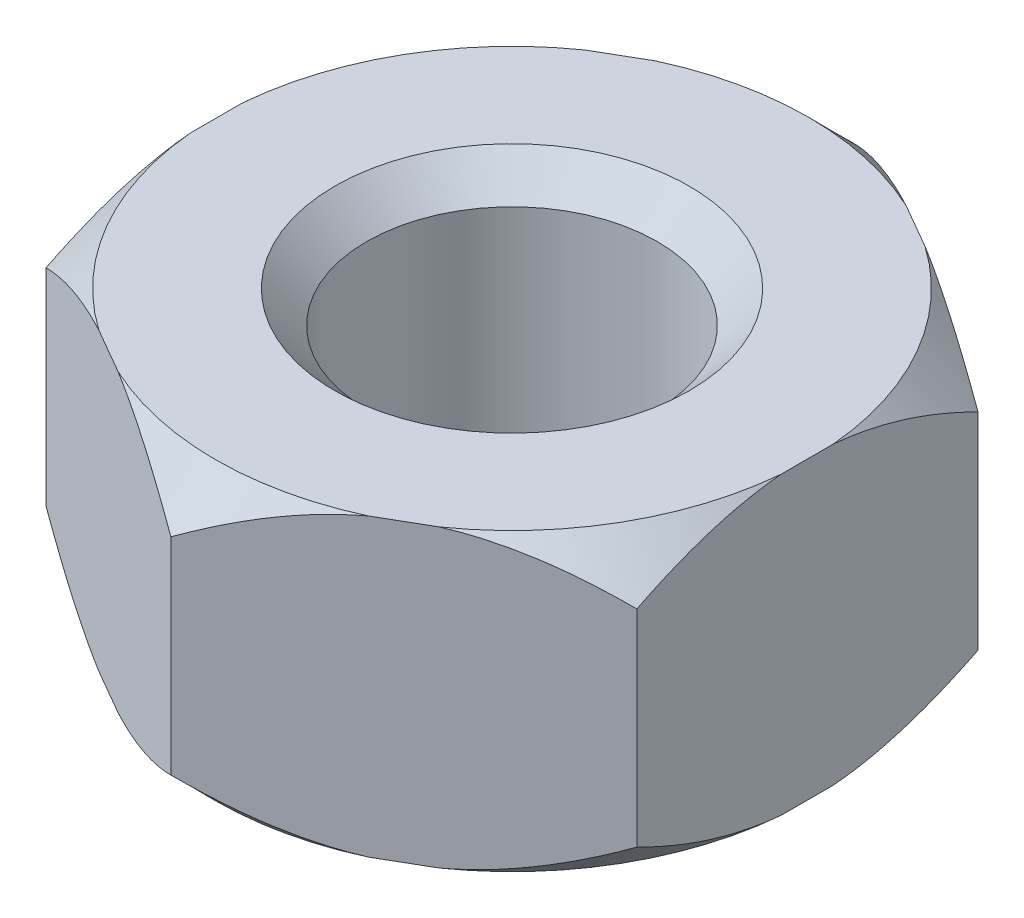
ISO-10303-21;
HEADER;
FILE_DESCRIPTION(('STEP AP214'),'2;1');
FILE_NAME('part.step','',(''),(''),'','','');
FILE_SCHEMA(('AUTOMOTIVE_DESIGN { 1 0 10303 214 1 1 1 1 }'));
ENDSEC;
DATA;
#1=APPLICATION_CONTEXT('core data for automotive mechanical design processes');
#2=APPLICATION_PROTOCOL_DEFINITION('international standard','automotive_design',2000,#1);
#3=PRODUCT_CONTEXT('',#1,'mechanical');
#4=PRODUCT('Part','Part','',(#3));
#5=PRODUCT_RELATED_PRODUCT_CATEGORY('part','',(#4));
#6=PRODUCT_DEFINITION_FORMATION('','',#4);
#7=PRODUCT_DEFINITION_CONTEXT('part definition',#1,'design');
#8=PRODUCT_DEFINITION('design','',#6,#7);
#9=PRODUCT_DEFINITION_SHAPE('','',#8);
#10=(LENGTH_UNIT() NAMED_UNIT(*) SI_UNIT(.MILLI.,.METRE.));
#11=(NAMED_UNIT(*) PLANE_ANGLE_UNIT() SI_UNIT($,.RADIAN.));
#12=(NAMED_UNIT(*) SI_UNIT($,.STERADIAN.) SOLID_ANGLE_UNIT());
#13=UNCERTAINTY_MEASURE_WITH_UNIT(LENGTH_MEASURE(1.E-05),#10,'distance_accuracy_value','');
#14=(GEOMETRIC_REPRESENTATION_CONTEXT(3) GLOBAL_UNCERTAINTY_ASSIGNED_CONTEXT((#13)) GLOBAL_UNIT_ASSIGNED_CONTEXT((#10,
#11,#12)) REPRESENTATION_CONTEXT('',''));
#15=CARTESIAN_POINT('',(0.,0.,0.));
#16=DIRECTION('',(0.,0.,1.));
#17=DIRECTION('',(1.,0.,0.));
#18=AXIS2_PLACEMENT_3D('',#15,#16,#17);
#19=CARTESIAN_POINT('',(0.,5.,0.));
#20=DIRECTION('',(0.,1.,0.));
#21=DIRECTION('',(0.,0.,1.));
#22=AXIS2_PLACEMENT_3D('',#19,#20,#21);
#23=PLANE('',#22);
#24=CARTESIAN_POINT('',(0.,5.,0.));
#25=DIRECTION('',(0.,-1.,0.));
#26=DIRECTION('',(1.,0.,0.));
#27=AXIS2_PLACEMENT_3D('',#24,#25,#26);
#28=CIRCLE('',#27,3.);
#29=CARTESIAN_POINT('',(3.,5.,0.));
#30=VERTEX_POINT('',#29);
#31=EDGE_CURVE('E20',#30,#30,#28,.T.);
#32=ORIENTED_EDGE('',*,*,#31,.T.);
#33=EDGE_LOOP('',(#32));
#34=FACE_BOUND('',#33,.T.);
#35=CARTESIAN_POINT('',(0.,5.,0.));
#36=DIRECTION('',(0.,1.,0.));
#37=DIRECTION('',(0.,0.,1.));
#38=AXIS2_PLACEMENT_3D('',#35,#36,#37);
#39=CIRCLE('',#38,5.0192554586306);
#40=CARTESIAN_POINT('',(-5.,5.,0.439232693447428));
#41=VERTEX_POINT('',#40);
#42=CARTESIAN_POINT('',(-2.88038667069811,5.,4.11051067219849));
#43=VERTEX_POINT('',#42);
#44=EDGE_CURVE('E151',#41,#43,#39,.T.);
#45=ORIENTED_EDGE('',*,*,#44,.T.);
#46=DIRECTION('',(0.866025403784433,0.,0.500000000000009));
#47=VECTOR('',#46,1.);
#48=CARTESIAN_POINT('',(-5.,5.,2.8867513459481));
#49=LINE('',#48,#47);
#50=CARTESIAN_POINT('',(-2.11961332930199,5.,4.54974336564585));
#51=VERTEX_POINT('',#50);
#52=EDGE_CURVE('E274',#43,#51,#49,.T.);
#53=ORIENTED_EDGE('',*,*,#52,.T.);
#54=CARTESIAN_POINT('',(0.,5.,0.));
#55=DIRECTION('',(0.,1.,0.));
#56=DIRECTION('',(0.,0.,1.));
#57=AXIS2_PLACEMENT_3D('',#54,#55,#56);
#58=CIRCLE('',#57,5.0192554586306);
#59=CARTESIAN_POINT('',(2.11961332930199,5.,4.54974336564585));
#60=VERTEX_POINT('',#59);
#61=EDGE_CURVE('E305',#51,#60,#58,.T.);
#62=ORIENTED_EDGE('',*,*,#61,.T.);
#63=DIRECTION('',(0.866025403784433,0.,-0.500000000000009));
#64=VECTOR('',#63,1.);
#65=CARTESIAN_POINT('',(0.,5.,5.7735026918963));
#66=LINE('',#65,#64);
#67=CARTESIAN_POINT('',(2.88038667069811,5.,4.11051067219849));
#68=VERTEX_POINT('',#67);
#69=EDGE_CURVE('E11',#60,#68,#66,.T.);
#70=ORIENTED_EDGE('',*,*,#69,.T.);
#71=CARTESIAN_POINT('',(0.,5.,0.));
#72=DIRECTION('',(0.,1.,0.));
#73=DIRECTION('',(0.,0.,1.));
#74=AXIS2_PLACEMENT_3D('',#71,#72,#73);
#75=CIRCLE('',#74,5.0192554586306);
#76=CARTESIAN_POINT('',(5.,5.,0.439232693447428));
#77=VERTEX_POINT('',#76);
#78=EDGE_CURVE('E304',#68,#77,#75,.T.);
#79=ORIENTED_EDGE('',*,*,#78,.T.);
#80=DIRECTION('',(0.,0.,-1.));
#81=VECTOR('',#80,1.);
#82=CARTESIAN_POINT('',(5.,5.,2.8867513459481));
#83=LINE('',#82,#81);
#84=CARTESIAN_POINT('',(5.,5.,-0.439232693447428));
#85=VERTEX_POINT('',#84);
#86=EDGE_CURVE('E246',#77,#85,#83,.T.);
#87=ORIENTED_EDGE('',*,*,#86,.T.);
#88=CARTESIAN_POINT('',(0.,5.,0.));
#89=DIRECTION('',(0.,1.,0.));
#90=DIRECTION('',(0.,0.,1.));
#91=AXIS2_PLACEMENT_3D('',#88,#89,#90);
#92=CIRCLE('',#91,5.0192554586306);
#93=CARTESIAN_POINT('',(2.88038667069811,5.,-4.11051067219849));
#94=VERTEX_POINT('',#93);
#95=EDGE_CURVE('E327',#85,#94,#92,.T.);
#96=ORIENTED_EDGE('',*,*,#95,.T.);
#97=DIRECTION('',(-0.866025403784433,0.,-0.500000000000009));
#98=VECTOR('',#97,1.);
#99=CARTESIAN_POINT('',(5.,5.,-2.8867513459481));
#100=LINE('',#99,#98);
#101=CARTESIAN_POINT('',(2.11961332930199,5.,-4.54974336564585));
#102=VERTEX_POINT('',#101);
#103=EDGE_CURVE('E365',#94,#102,#100,.T.);
#104=ORIENTED_EDGE('',*,*,#103,.T.);
#105=CARTESIAN_POINT('',(0.,5.,0.));
#106=DIRECTION('',(0.,1.,0.));
#107=DIRECTION('',(0.,0.,1.));
#108=AXIS2_PLACEMENT_3D('',#105,#106,#107);
#109=CIRCLE('',#108,5.0192554586306);
#110=CARTESIAN_POINT('',(-2.11961332930199,5.,-4.54974336564585));
#111=VERTEX_POINT('',#110);
#112=EDGE_CURVE('E500',#102,#111,#109,.T.);
#113=ORIENTED_EDGE('',*,*,#112,.T.);
#114=DIRECTION('',(-0.866025403784433,0.,0.500000000000009));
#115=VECTOR('',#114,1.);
#116=CARTESIAN_POINT('',(0.,5.,-5.7735026918963));
#117=LINE('',#116,#115);
#118=CARTESIAN_POINT('',(-2.88038667069811,5.,-4.11051067219849));
#119=VERTEX_POINT('',#118);
#120=EDGE_CURVE('E267',#111,#119,#117,.T.);
#121=ORIENTED_EDGE('',*,*,#120,.T.);
#122=CARTESIAN_POINT('',(0.,5.,0.));
#123=DIRECTION('',(0.,1.,0.));
#124=DIRECTION('',(0.,0.,1.));
#125=AXIS2_PLACEMENT_3D('',#122,#123,#124);
#126=CIRCLE('',#125,5.0192554586306);
#127=CARTESIAN_POINT('',(-5.,5.,-0.439232693447428));
#128=VERTEX_POINT('',#127);
#129=EDGE_CURVE('E143',#119,#128,#126,.T.);
#130=ORIENTED_EDGE('',*,*,#129,.T.);
#131=DIRECTION('',(0.,0.,1.));
#132=VECTOR('',#131,1.);
#133=CARTESIAN_POINT('',(-5.,5.,-2.8867513459481));
#134=LINE('',#133,#132);
#135=EDGE_CURVE('E278',#128,#41,#134,.T.);
#136=ORIENTED_EDGE('',*,*,#135,.T.);
#137=EDGE_LOOP('',(#45,#53,#62,#70,#79,#87,#96,#104,#113,#121,#130,#136));
#138=FACE_BOUND('',#137,.T.);
#139=ADVANCED_FACE('F16',(#34,#138),#23,.T.);
#140=CARTESIAN_POINT('',(0.,0.,5.7735026918963));
#141=DIRECTION('',(0.500000000000009,0.,0.866025403784433));
#142=DIRECTION('',(0.866025403784433,0.,-0.500000000000009));
#143=AXIS2_PLACEMENT_3D('',#140,#141,#142);
#144=PLANE('',#143);
#145=CARTESIAN_POINT('',(0.,0.7542472332657,5.7735026918963));
#146=CARTESIAN_POINT('',(1.13387079482611,0.0996066246465835,5.11886208327718));
#147=CARTESIAN_POINT('',(2.11961332930197,0.,4.54974336564586));
#148=(BOUNDED_CURVE() B_SPLINE_CURVE(2,(#145,#146,#147),.UNSPECIFIED.,.F.,
.F.) B_SPLINE_CURVE_WITH_KNOTS((3,3),(0.2476817583387,0.548103615273101),
.UNSPECIFIED.) CURVE() GEOMETRIC_REPRESENTATION_ITEM() RATIONAL_B_SPLINE_CURVE((1.04467917037567,
1.04943604844896,1.)) REPRESENTATION_ITEM(''));
#149=CARTESIAN_POINT('',(0.,0.7542472332657,5.7735026918963));
#150=VERTEX_POINT('',#149);
#151=CARTESIAN_POINT('',(2.11961332930198,0.,4.54974336564585));
#152=VERTEX_POINT('',#151);
#153=EDGE_CURVE('E205',#150,#152,#148,.T.);
#154=ORIENTED_EDGE('',*,*,#153,.T.);
#155=DIRECTION('',(0.866025403784433,0.,-0.500000000000009));
#156=VECTOR('',#155,1.);
#157=CARTESIAN_POINT('',(0.,0.,5.7735026918963));
#158=LINE('',#157,#156);
#159=CARTESIAN_POINT('',(2.88038667069813,0.,4.11051067219849));
#160=VERTEX_POINT('',#159);
#161=EDGE_CURVE('E252',#152,#160,#158,.T.);
#162=ORIENTED_EDGE('',*,*,#161,.T.);
#163=CARTESIAN_POINT('',(2.88038667069813,0.,4.11051067219848));
#164=CARTESIAN_POINT('',(3.86612920517395,0.0996066246465778,3.54139195456719));
#165=CARTESIAN_POINT('',(5.,0.754247233265643,2.8867513459481));
#166=(BOUNDED_CURVE() B_SPLINE_CURVE(2,(#163,#164,#165),.UNSPECIFIED.,.F.,
.F.) B_SPLINE_CURVE_WITH_KNOTS((3,3),(0.,0.300421856934388),
.UNSPECIFIED.) CURVE() GEOMETRIC_REPRESENTATION_ITEM() RATIONAL_B_SPLINE_CURVE((1.,
1.04943604844896,1.04467917037568)) REPRESENTATION_ITEM(''));
#167=CARTESIAN_POINT('',(5.,0.754247233265643,2.8867513459481));
#168=VERTEX_POINT('',#167);
#169=EDGE_CURVE('E349',#160,#168,#166,.T.);
#170=ORIENTED_EDGE('',*,*,#169,.T.);
#171=DIRECTION('',(0.,1.,0.));
#172=VECTOR('',#171,1.);
#173=CARTESIAN_POINT('',(5.,0.,2.8867513459481));
#174=LINE('',#173,#172);
#175=CARTESIAN_POINT('',(5.,4.24575276673436,2.8867513459481));
#176=VERTEX_POINT('',#175);
#177=EDGE_CURVE('E323',#168,#176,#174,.T.);
#178=ORIENTED_EDGE('',*,*,#177,.T.);
#179=CARTESIAN_POINT('',(5.00000000000001,4.24575276673436,2.8867513459481));
#180=CARTESIAN_POINT('',(3.86612920517394,4.90039337535343,3.5413919545672));
#181=CARTESIAN_POINT('',(2.88038667069813,5.,4.11051067219849));
#182=(BOUNDED_CURVE() B_SPLINE_CURVE(2,(#179,#180,#181),.UNSPECIFIED.,.F.,
.F.) B_SPLINE_CURVE_WITH_KNOTS((3,3),(0.247681758338713,0.548103615273102),
.UNSPECIFIED.) CURVE() GEOMETRIC_REPRESENTATION_ITEM() RATIONAL_B_SPLINE_CURVE((1.04467917037568,
1.04943604844896,1.)) REPRESENTATION_ITEM(''));
#183=EDGE_CURVE('E314',#176,#68,#182,.T.);
#184=ORIENTED_EDGE('',*,*,#183,.T.);
#185=ORIENTED_EDGE('',*,*,#69,.F.);
#186=CARTESIAN_POINT('',(2.11961332930198,5.,4.54974336564585));
#187=CARTESIAN_POINT('',(1.13387079482612,4.90039337535343,5.11886208327718));
#188=CARTESIAN_POINT('',(0.,4.2457527667343,5.7735026918963));
#189=(BOUNDED_CURVE() B_SPLINE_CURVE(2,(#186,#187,#188),.UNSPECIFIED.,.F.,
.F.) B_SPLINE_CURVE_WITH_KNOTS((3,3),(0.,0.300421856934402),
.UNSPECIFIED.) CURVE() GEOMETRIC_REPRESENTATION_ITEM() RATIONAL_B_SPLINE_CURVE((1.,
1.04943604844896,1.04467917037567)) REPRESENTATION_ITEM(''));
#190=CARTESIAN_POINT('',(0.,4.2457527667343,5.7735026918963));
#191=VERTEX_POINT('',#190);
#192=EDGE_CURVE('E317',#60,#191,#189,.T.);
#193=ORIENTED_EDGE('',*,*,#192,.T.);
#194=DIRECTION('',(0.,1.,0.));
#195=VECTOR('',#194,1.);
#196=CARTESIAN_POINT('',(0.,0.,5.7735026918963));
#197=LINE('',#196,#195);
#198=EDGE_CURVE('E275',#150,#191,#197,.T.);
#199=ORIENTED_EDGE('',*,*,#198,.F.);
#200=EDGE_LOOP('',(#154,#162,#170,#178,#184,#185,#193,#199));
#201=FACE_BOUND('',#200,.T.);
#202=ADVANCED_FACE('F612',(#201),#144,.T.);
#203=CARTESIAN_POINT('',(0.,0.27075,0.));
#204=DIRECTION('',(0.,-1.,0.));
#205=DIRECTION('',(1.,0.,0.));
#206=AXIS2_PLACEMENT_3D('',#203,#204,#205);
#207=CONICAL_SURFACE('',#206,2.72925,0.785398163397449);
#208=CARTESIAN_POINT('',(0.,0.5415,0.));
#209=DIRECTION('',(0.,-1.,0.));
#210=DIRECTION('',(1.,0.,0.));
#211=AXIS2_PLACEMENT_3D('',#208,#209,#210);
#212=CIRCLE('',#211,2.4585);
#213=CARTESIAN_POINT('',(2.4585,0.5415,0.));
#214=VERTEX_POINT('',#213);
#215=EDGE_CURVE('E27',#214,#214,#212,.T.);
#216=ORIENTED_EDGE('',*,*,#215,.F.);
#217=EDGE_LOOP('',(#216));
#218=FACE_BOUND('',#217,.T.);
#219=CARTESIAN_POINT('',(0.,0.,0.));
#220=DIRECTION('',(0.,1.,0.));
#221=DIRECTION('',(1.,0.,0.));
#222=AXIS2_PLACEMENT_3D('',#219,#220,#221);
#223=CIRCLE('',#222,3.);
#224=CARTESIAN_POINT('',(3.,0.,0.));
#225=VERTEX_POINT('',#224);
#226=EDGE_CURVE('E238',#225,#225,#223,.T.);
#227=ORIENTED_EDGE('',*,*,#226,.F.);
#228=EDGE_LOOP('',(#227));
#229=FACE_BOUND('',#228,.T.);
#230=ADVANCED_FACE('F637',(#218,#229),#207,.F.);
#231=CARTESIAN_POINT('',(0.,2.5,0.));
#232=DIRECTION('',(0.,1.,0.));
#233=DIRECTION('',(1.,0.,0.));
#234=AXIS2_PLACEMENT_3D('',#231,#232,#233);
#235=CYLINDRICAL_SURFACE('',#234,2.4585);
#236=CARTESIAN_POINT('',(0.,4.4585,0.));
#237=DIRECTION('',(0.,-1.,0.));
#238=DIRECTION('',(1.,0.,0.));
#239=AXIS2_PLACEMENT_3D('',#236,#237,#238);
#240=CIRCLE('',#239,2.4585);
#241=CARTESIAN_POINT('',(2.4585,4.4585,0.));
#242=VERTEX_POINT('',#241);
#243=EDGE_CURVE('E268',#242,#242,#240,.T.);
#244=ORIENTED_EDGE('',*,*,#243,.F.);
#245=EDGE_LOOP('',(#244));
#246=FACE_BOUND('',#245,.T.);
#247=ORIENTED_EDGE('',*,*,#215,.T.);
#248=EDGE_LOOP('',(#247));
#249=FACE_BOUND('',#248,.T.);
#250=ADVANCED_FACE('F18',(#246,#249),#235,.F.);
#251=CARTESIAN_POINT('',(0.,4.72925,0.));
#252=DIRECTION('',(0.,1.,0.));
#253=DIRECTION('',(1.,0.,0.));
#254=AXIS2_PLACEMENT_3D('',#251,#252,#253);
#255=CONICAL_SURFACE('',#254,2.72925,0.785398163397449);
#256=ORIENTED_EDGE('',*,*,#31,.F.);
#257=EDGE_LOOP('',(#256));
#258=FACE_BOUND('',#257,.T.);
#259=ORIENTED_EDGE('',*,*,#243,.T.);
#260=EDGE_LOOP('',(#259));
#261=FACE_BOUND('',#260,.T.);
#262=ADVANCED_FACE('F660',(#258,#261),#255,.F.);
#263=CARTESIAN_POINT('',(-5.,0.,2.8867513459481));
#264=DIRECTION('',(-0.500000000000009,0.,0.866025403784433));
#265=DIRECTION('',(0.866025403784433,0.,0.500000000000009));
#266=AXIS2_PLACEMENT_3D('',#263,#264,#265);
#267=PLANE('',#266);
#268=CARTESIAN_POINT('',(-2.11961332930199,0.,4.54974336564585));
#269=CARTESIAN_POINT('',(-1.13387079482612,0.0996066246465761,5.11886208327717));
#270=CARTESIAN_POINT('',(0.,0.754247233265701,5.77350269189631));
#271=(BOUNDED_CURVE() B_SPLINE_CURVE(2,(#268,#269,#270),.UNSPECIFIED.,.F.,
.F.) B_SPLINE_CURVE_WITH_KNOTS((3,3),(0.,0.300421856934404),
.UNSPECIFIED.) CURVE() GEOMETRIC_REPRESENTATION_ITEM() RATIONAL_B_SPLINE_CURVE((1.,
1.04943604844896,1.04467917037567)) REPRESENTATION_ITEM(''));
#272=CARTESIAN_POINT('',(-2.11961332930198,0.,4.54974336564585));
#273=VERTEX_POINT('',#272);
#274=EDGE_CURVE('E384',#273,#150,#271,.T.);
#275=ORIENTED_EDGE('',*,*,#274,.T.);
#276=ORIENTED_EDGE('',*,*,#198,.T.);
#277=CARTESIAN_POINT('',(0.,4.24575276673431,5.77350269189631));
#278=CARTESIAN_POINT('',(-1.13387079482612,4.90039337535343,5.11886208327718));
#279=CARTESIAN_POINT('',(-2.11961332930199,5.,4.54974336564585));
#280=(BOUNDED_CURVE() B_SPLINE_CURVE(2,(#277,#278,#279),.UNSPECIFIED.,.F.,
.F.) B_SPLINE_CURVE_WITH_KNOTS((3,3),(0.247681758338699,0.548103615273103),
.UNSPECIFIED.) CURVE() GEOMETRIC_REPRESENTATION_ITEM() RATIONAL_B_SPLINE_CURVE((1.04467917037568,
1.04943604844896,1.)) REPRESENTATION_ITEM(''));
#281=EDGE_CURVE('E299',#191,#51,#280,.T.);
#282=ORIENTED_EDGE('',*,*,#281,.T.);
#283=ORIENTED_EDGE('',*,*,#52,.F.);
#284=CARTESIAN_POINT('',(-2.88038667069811,5.,4.11051067219849));
#285=CARTESIAN_POINT('',(-3.86612920517394,4.90039337535343,3.5413919545672));
#286=CARTESIAN_POINT('',(-5.,4.24575276673436,2.8867513459481));
#287=(BOUNDED_CURVE() B_SPLINE_CURVE(2,(#284,#285,#286),.UNSPECIFIED.,.F.,
.F.) B_SPLINE_CURVE_WITH_KNOTS((3,3),(0.,0.30042185693439),
.UNSPECIFIED.) CURVE() GEOMETRIC_REPRESENTATION_ITEM() RATIONAL_B_SPLINE_CURVE((1.,
1.04943604844896,1.04467917037568)) REPRESENTATION_ITEM(''));
#288=CARTESIAN_POINT('',(-5.,4.24575276673436,2.8867513459481));
#289=VERTEX_POINT('',#288);
#290=EDGE_CURVE('E200',#43,#289,#287,.T.);
#291=ORIENTED_EDGE('',*,*,#290,.T.);
#292=DIRECTION('',(0.,1.,0.));
#293=VECTOR('',#292,1.);
#294=CARTESIAN_POINT('',(-5.,0.,2.8867513459481));
#295=LINE('',#294,#293);
#296=CARTESIAN_POINT('',(-5.,0.754247233265643,2.8867513459481));
#297=VERTEX_POINT('',#296);
#298=EDGE_CURVE('E194',#297,#289,#295,.T.);
#299=ORIENTED_EDGE('',*,*,#298,.F.);
#300=CARTESIAN_POINT('',(-5.00000000000001,0.754247233265644,2.8867513459481));
#301=CARTESIAN_POINT('',(-3.86612920517394,0.0996066246465715,3.5413919545672));
#302=CARTESIAN_POINT('',(-2.88038667069811,0.,4.11051067219849));
#303=(BOUNDED_CURVE() B_SPLINE_CURVE(2,(#300,#301,#302),.UNSPECIFIED.,.F.,
.F.) B_SPLINE_CURVE_WITH_KNOTS((3,3),(0.247681758338713,0.548103615273103),
.UNSPECIFIED.) CURVE() GEOMETRIC_REPRESENTATION_ITEM() RATIONAL_B_SPLINE_CURVE((1.04467917037567,
1.04943604844896,1.)) REPRESENTATION_ITEM(''));
#304=CARTESIAN_POINT('',(-2.88038667069813,0.,4.11051067219849));
#305=VERTEX_POINT('',#304);
#306=EDGE_CURVE('E199',#297,#305,#303,.T.);
#307=ORIENTED_EDGE('',*,*,#306,.T.);
#308=DIRECTION('',(0.866025403784433,0.,0.500000000000009));
#309=VECTOR('',#308,1.);
#310=CARTESIAN_POINT('',(-5.,0.,2.8867513459481));
#311=LINE('',#310,#309);
#312=EDGE_CURVE('E243',#305,#273,#311,.T.);
#313=ORIENTED_EDGE('',*,*,#312,.T.);
#314=EDGE_LOOP('',(#275,#276,#282,#283,#291,#299,#307,#313));
#315=FACE_BOUND('',#314,.T.);
#316=ADVANCED_FACE('F197',(#315),#267,.T.);
#317=CARTESIAN_POINT('',(0.,4.59584969796075,0.));
#318=DIRECTION('',(0.,-1.,0.));
#319=DIRECTION('',(0.,0.,1.));
#320=AXIS2_PLACEMENT_3D('',#317,#318,#319);
#321=CONICAL_SURFACE('',#320,5.42340576066985,0.785398163397448);
#322=CARTESIAN_POINT('',(-5.,4.24575276673436,2.8867513459481));
#323=CARTESIAN_POINT('',(-5.,4.90039337535342,1.57747012870996));
#324=CARTESIAN_POINT('',(-5.,5.,0.439232693447428));
#325=(BOUNDED_CURVE() B_SPLINE_CURVE(2,(#322,#323,#324),.UNSPECIFIED.,.F.,
.F.) B_SPLINE_CURVE_WITH_KNOTS((3,3),(0.247681758338714,0.548103615273096),
.UNSPECIFIED.) CURVE() GEOMETRIC_REPRESENTATION_ITEM() RATIONAL_B_SPLINE_CURVE((1.04467917037567,
1.04943604844895,1.)) REPRESENTATION_ITEM(''));
#326=EDGE_CURVE('E204',#289,#41,#325,.T.);
#327=ORIENTED_EDGE('',*,*,#326,.F.);
#328=ORIENTED_EDGE('',*,*,#290,.F.);
#329=ORIENTED_EDGE('',*,*,#44,.F.);
#330=EDGE_LOOP('',(#327,#328,#329));
#331=FACE_BOUND('',#330,.T.);
#332=ADVANCED_FACE('F647',(#331),#321,.T.);
#333=CARTESIAN_POINT('',(0.,4.59584969796075,0.));
#334=DIRECTION('',(0.,-1.,0.));
#335=DIRECTION('',(0.,0.,1.));
#336=AXIS2_PLACEMENT_3D('',#333,#334,#335);
#337=CONICAL_SURFACE('',#336,5.42340576066985,0.785398163397448);
#338=CARTESIAN_POINT('',(-5.,5.,-0.439232693447428));
#339=CARTESIAN_POINT('',(-5.,4.90039337535342,-1.57747012870996));
#340=CARTESIAN_POINT('',(-5.,4.24575276673436,-2.8867513459481));
#341=(BOUNDED_CURVE() B_SPLINE_CURVE(2,(#338,#339,#340),.UNSPECIFIED.,.F.,
.F.) B_SPLINE_CURVE_WITH_KNOTS((3,3),(0.,0.300421856934383),
.UNSPECIFIED.) CURVE() GEOMETRIC_REPRESENTATION_ITEM() RATIONAL_B_SPLINE_CURVE((1.,
1.04943604844895,1.04467917037567)) REPRESENTATION_ITEM(''));
#342=CARTESIAN_POINT('',(-5.,4.24575276673436,-2.8867513459481));
#343=VERTEX_POINT('',#342);
#344=EDGE_CURVE('E281',#128,#343,#341,.T.);
#345=ORIENTED_EDGE('',*,*,#344,.F.);
#346=ORIENTED_EDGE('',*,*,#129,.F.);
#347=CARTESIAN_POINT('',(-5.00000000000001,4.24575276673436,-2.8867513459481));
#348=CARTESIAN_POINT('',(-3.86612920517394,4.90039337535343,-3.5413919545672));
#349=CARTESIAN_POINT('',(-2.88038667069813,5.,-4.11051067219849));
#350=(BOUNDED_CURVE() B_SPLINE_CURVE(2,(#347,#348,#349),.UNSPECIFIED.,.F.,
.F.) B_SPLINE_CURVE_WITH_KNOTS((3,3),(0.247681758338713,0.548103615273102),
.UNSPECIFIED.) CURVE() GEOMETRIC_REPRESENTATION_ITEM() RATIONAL_B_SPLINE_CURVE((1.04467917037568,
1.04943604844896,1.)) REPRESENTATION_ITEM(''));
#351=EDGE_CURVE('E258',#343,#119,#350,.T.);
#352=ORIENTED_EDGE('',*,*,#351,.F.);
#353=EDGE_LOOP('',(#345,#346,#352));
#354=FACE_BOUND('',#353,.T.);
#355=ADVANCED_FACE('F644',(#354),#337,.T.);
#356=CARTESIAN_POINT('',(0.,4.59584969796075,0.));
#357=DIRECTION('',(0.,-1.,0.));
#358=DIRECTION('',(0.,0.,1.));
#359=AXIS2_PLACEMENT_3D('',#356,#357,#358);
#360=CONICAL_SURFACE('',#359,5.42340576066985,0.785398163397448);
#361=CARTESIAN_POINT('',(-2.11961332930198,5.,-4.54974336564585));
#362=CARTESIAN_POINT('',(-1.13387079482612,4.90039337535343,-5.11886208327718));
#363=CARTESIAN_POINT('',(0.,4.2457527667343,-5.7735026918963));
#364=(BOUNDED_CURVE() B_SPLINE_CURVE(2,(#361,#362,#363),.UNSPECIFIED.,.F.,
.F.) B_SPLINE_CURVE_WITH_KNOTS((3,3),(0.,0.300421856934402),
.UNSPECIFIED.) CURVE() GEOMETRIC_REPRESENTATION_ITEM() RATIONAL_B_SPLINE_CURVE((1.,
1.04943604844896,1.04467917037567)) REPRESENTATION_ITEM(''));
#365=CARTESIAN_POINT('',(0.,4.2457527667343,-5.7735026918963));
#366=VERTEX_POINT('',#365);
#367=EDGE_CURVE('E464',#111,#366,#364,.T.);
#368=ORIENTED_EDGE('',*,*,#367,.F.);
#369=ORIENTED_EDGE('',*,*,#112,.F.);
#370=CARTESIAN_POINT('',(0.,4.24575276673431,-5.77350269189631));
#371=CARTESIAN_POINT('',(1.13387079482612,4.90039337535343,-5.11886208327718));
#372=CARTESIAN_POINT('',(2.11961332930199,5.,-4.54974336564585));
#373=(BOUNDED_CURVE() B_SPLINE_CURVE(2,(#370,#371,#372),.UNSPECIFIED.,.F.,
.F.) B_SPLINE_CURVE_WITH_KNOTS((3,3),(0.247681758338699,0.548103615273103),
.UNSPECIFIED.) CURVE() GEOMETRIC_REPRESENTATION_ITEM() RATIONAL_B_SPLINE_CURVE((1.04467917037568,
1.04943604844896,1.)) REPRESENTATION_ITEM(''));
#374=EDGE_CURVE('E359',#366,#102,#373,.T.);
#375=ORIENTED_EDGE('',*,*,#374,.F.);
#376=EDGE_LOOP('',(#368,#369,#375));
#377=FACE_BOUND('',#376,.T.);
#378=ADVANCED_FACE('F530',(#377),#360,.T.);
#379=CARTESIAN_POINT('',(0.,4.59584969796075,0.));
#380=DIRECTION('',(0.,-1.,0.));
#381=DIRECTION('',(0.,0.,1.));
#382=AXIS2_PLACEMENT_3D('',#379,#380,#381);
#383=CONICAL_SURFACE('',#382,5.42340576066985,0.785398163397448);
#384=CARTESIAN_POINT('',(2.88038667069811,5.,-4.11051067219849));
#385=CARTESIAN_POINT('',(3.86612920517394,4.90039337535343,-3.5413919545672));
#386=CARTESIAN_POINT('',(5.,4.24575276673436,-2.8867513459481));
#387=(BOUNDED_CURVE() B_SPLINE_CURVE(2,(#384,#385,#386),.UNSPECIFIED.,.F.,
.F.) B_SPLINE_CURVE_WITH_KNOTS((3,3),(0.,0.30042185693439),
.UNSPECIFIED.) CURVE() GEOMETRIC_REPRESENTATION_ITEM() RATIONAL_B_SPLINE_CURVE((1.,
1.04943604844896,1.04467917037568)) REPRESENTATION_ITEM(''));
#388=CARTESIAN_POINT('',(5.,4.24575276673436,-2.8867513459481));
#389=VERTEX_POINT('',#388);
#390=EDGE_CURVE('E416',#94,#389,#387,.T.);
#391=ORIENTED_EDGE('',*,*,#390,.F.);
#392=ORIENTED_EDGE('',*,*,#95,.F.);
#393=CARTESIAN_POINT('',(5.,4.24575276673436,-2.8867513459481));
#394=CARTESIAN_POINT('',(5.,4.90039337535342,-1.57747012870996));
#395=CARTESIAN_POINT('',(5.,5.,-0.439232693447428));
#396=(BOUNDED_CURVE() B_SPLINE_CURVE(2,(#393,#394,#395),.UNSPECIFIED.,.F.,
.F.) B_SPLINE_CURVE_WITH_KNOTS((3,3),(0.247681758338714,0.548103615273096),
.UNSPECIFIED.) CURVE() GEOMETRIC_REPRESENTATION_ITEM() RATIONAL_B_SPLINE_CURVE((1.04467917037567,
1.04943604844895,1.)) REPRESENTATION_ITEM(''));
#397=EDGE_CURVE('E251',#389,#85,#396,.T.);
#398=ORIENTED_EDGE('',*,*,#397,.F.);
#399=EDGE_LOOP('',(#391,#392,#398));
#400=FACE_BOUND('',#399,.T.);
#401=ADVANCED_FACE('F605',(#400),#383,.T.);
#402=CARTESIAN_POINT('',(0.,4.59584969796075,0.));
#403=DIRECTION('',(0.,-1.,0.));
#404=DIRECTION('',(0.,0.,1.));
#405=AXIS2_PLACEMENT_3D('',#402,#403,#404);
#406=CONICAL_SURFACE('',#405,5.42340576066985,0.785398163397448);
#407=CARTESIAN_POINT('',(5.,5.,0.439232693447428));
#408=CARTESIAN_POINT('',(5.,4.90039337535342,1.57747012870996));
#409=CARTESIAN_POINT('',(5.,4.24575276673436,2.8867513459481));
#410=(BOUNDED_CURVE() B_SPLINE_CURVE(2,(#407,#408,#409),.UNSPECIFIED.,.F.,
.F.) B_SPLINE_CURVE_WITH_KNOTS((3,3),(0.,0.300421856934383),
.UNSPECIFIED.) CURVE() GEOMETRIC_REPRESENTATION_ITEM() RATIONAL_B_SPLINE_CURVE((1.,
1.04943604844895,1.04467917037567)) REPRESENTATION_ITEM(''));
#411=EDGE_CURVE('E250',#77,#176,#410,.T.);
#412=ORIENTED_EDGE('',*,*,#411,.F.);
#413=ORIENTED_EDGE('',*,*,#78,.F.);
#414=ORIENTED_EDGE('',*,*,#183,.F.);
#415=EDGE_LOOP('',(#412,#413,#414));
#416=FACE_BOUND('',#415,.T.);
#417=ADVANCED_FACE('F610',(#416),#406,.T.);
#418=CARTESIAN_POINT('',(0.,4.59584969796075,0.));
#419=DIRECTION('',(0.,-1.,0.));
#420=DIRECTION('',(0.,0.,1.));
#421=AXIS2_PLACEMENT_3D('',#418,#419,#420);
#422=CONICAL_SURFACE('',#421,5.42340576066985,0.785398163397448);
#423=ORIENTED_EDGE('',*,*,#192,.F.);
#424=ORIENTED_EDGE('',*,*,#61,.F.);
#425=ORIENTED_EDGE('',*,*,#281,.F.);
#426=EDGE_LOOP('',(#423,#424,#425));
#427=FACE_BOUND('',#426,.T.);
#428=ADVANCED_FACE('F619',(#427),#422,.T.);
#429=CARTESIAN_POINT('',(5.,0.,2.8867513459481));
#430=DIRECTION('',(1.,0.,0.));
#431=DIRECTION('',(0.,0.,-1.));
#432=AXIS2_PLACEMENT_3D('',#429,#430,#431);
#433=PLANE('',#432);
#434=CARTESIAN_POINT('',(5.,0.,-0.439232693447428));
#435=CARTESIAN_POINT('',(5.00000000000001,0.0996066246465891,-1.57747012870997));
#436=CARTESIAN_POINT('',(5.00000000000001,0.754247233265644,-2.8867513459481));
#437=(BOUNDED_CURVE() B_SPLINE_CURVE(2,(#434,#435,#436),.UNSPECIFIED.,.F.,
.F.) B_SPLINE_CURVE_WITH_KNOTS((3,3),(0.,0.300421856934383),
.UNSPECIFIED.) CURVE() GEOMETRIC_REPRESENTATION_ITEM() RATIONAL_B_SPLINE_CURVE((1.,
1.04943604844895,1.04467917037567)) REPRESENTATION_ITEM(''));
#438=CARTESIAN_POINT('',(5.,0.,-0.439232693447428));
#439=VERTEX_POINT('',#438);
#440=CARTESIAN_POINT('',(5.,0.754247233265643,-2.8867513459481));
#441=VERTEX_POINT('',#440);
#442=EDGE_CURVE('E286',#439,#441,#437,.T.);
#443=ORIENTED_EDGE('',*,*,#442,.T.);
#444=DIRECTION('',(0.,1.,0.));
#445=VECTOR('',#444,1.);
#446=CARTESIAN_POINT('',(5.,0.,-2.8867513459481));
#447=LINE('',#446,#445);
#448=EDGE_CURVE('E422',#441,#389,#447,.T.);
#449=ORIENTED_EDGE('',*,*,#448,.T.);
#450=ORIENTED_EDGE('',*,*,#397,.T.);
#451=ORIENTED_EDGE('',*,*,#86,.F.);
#452=ORIENTED_EDGE('',*,*,#411,.T.);
#453=ORIENTED_EDGE('',*,*,#177,.F.);
#454=CARTESIAN_POINT('',(5.00000000000001,0.754247233265644,2.8867513459481));
#455=CARTESIAN_POINT('',(5.00000000000001,0.0996066246465894,1.57747012870997));
#456=CARTESIAN_POINT('',(5.,0.,0.439232693447428));
#457=(BOUNDED_CURVE() B_SPLINE_CURVE(2,(#454,#455,#456),.UNSPECIFIED.,.F.,
.F.) B_SPLINE_CURVE_WITH_KNOTS((3,3),(0.247681758338714,0.548103615273096),
.UNSPECIFIED.) CURVE() GEOMETRIC_REPRESENTATION_ITEM() RATIONAL_B_SPLINE_CURVE((1.04467917037567,
1.04943604844895,1.)) REPRESENTATION_ITEM(''));
#458=CARTESIAN_POINT('',(5.,0.,0.439232693447428));
#459=VERTEX_POINT('',#458);
#460=EDGE_CURVE('E234',#168,#459,#457,.T.);
#461=ORIENTED_EDGE('',*,*,#460,.T.);
#462=DIRECTION('',(0.,0.,-1.));
#463=VECTOR('',#462,1.);
#464=CARTESIAN_POINT('',(5.,0.,2.8867513459481));
#465=LINE('',#464,#463);
#466=EDGE_CURVE('E254',#459,#439,#465,.T.);
#467=ORIENTED_EDGE('',*,*,#466,.T.);
#468=EDGE_LOOP('',(#443,#449,#450,#451,#452,#453,#461,#467));
#469=FACE_BOUND('',#468,.T.);
#470=ADVANCED_FACE('F591',(#469),#433,.T.);
#471=CARTESIAN_POINT('',(0.,0.,0.));
#472=DIRECTION('',(0.,1.,0.));
#473=DIRECTION('',(0.,0.,1.));
#474=AXIS2_PLACEMENT_3D('',#471,#472,#473);
#475=PLANE('',#474);
#476=CARTESIAN_POINT('',(0.,0.,0.));
#477=DIRECTION('',(0.,-1.,0.));
#478=DIRECTION('',(0.,0.,1.));
#479=AXIS2_PLACEMENT_3D('',#476,#477,#478);
#480=CIRCLE('',#479,5.0192554586306);
#481=EDGE_CURVE('E380',#152,#273,#480,.T.);
#482=ORIENTED_EDGE('',*,*,#481,.T.);
#483=ORIENTED_EDGE('',*,*,#312,.F.);
#484=CARTESIAN_POINT('',(0.,0.,0.));
#485=DIRECTION('',(0.,-1.,0.));
#486=DIRECTION('',(0.,0.,1.));
#487=AXIS2_PLACEMENT_3D('',#484,#485,#486);
#488=CIRCLE('',#487,5.0192554586306);
#489=CARTESIAN_POINT('',(-5.,0.,0.439232693447428));
#490=VERTEX_POINT('',#489);
#491=EDGE_CURVE('E217',#305,#490,#488,.T.);
#492=ORIENTED_EDGE('',*,*,#491,.T.);
#493=DIRECTION('',(0.,0.,1.));
#494=VECTOR('',#493,1.);
#495=CARTESIAN_POINT('',(-5.,0.,-2.8867513459481));
#496=LINE('',#495,#494);
#497=CARTESIAN_POINT('',(-5.,0.,-0.439232693447428));
#498=VERTEX_POINT('',#497);
#499=EDGE_CURVE('E212',#498,#490,#496,.T.);
#500=ORIENTED_EDGE('',*,*,#499,.F.);
#501=CARTESIAN_POINT('',(0.,0.,0.));
#502=DIRECTION('',(0.,-1.,0.));
#503=DIRECTION('',(0.,0.,1.));
#504=AXIS2_PLACEMENT_3D('',#501,#502,#503);
#505=CIRCLE('',#504,5.0192554586306);
#506=CARTESIAN_POINT('',(-2.88038667069813,0.,-4.11051067219849));
#507=VERTEX_POINT('',#506);
#508=EDGE_CURVE('E221',#498,#507,#505,.T.);
#509=ORIENTED_EDGE('',*,*,#508,.T.);
#510=DIRECTION('',(-0.866025403784433,0.,0.500000000000009));
#511=VECTOR('',#510,1.);
#512=CARTESIAN_POINT('',(0.,0.,-5.7735026918963));
#513=LINE('',#512,#511);
#514=CARTESIAN_POINT('',(-2.11961332930198,0.,-4.54974336564585));
#515=VERTEX_POINT('',#514);
#516=EDGE_CURVE('E366',#515,#507,#513,.T.);
#517=ORIENTED_EDGE('',*,*,#516,.F.);
#518=CARTESIAN_POINT('',(0.,0.,0.));
#519=DIRECTION('',(0.,-1.,0.));
#520=DIRECTION('',(0.,0.,1.));
#521=AXIS2_PLACEMENT_3D('',#518,#519,#520);
#522=CIRCLE('',#521,5.0192554586306);
#523=CARTESIAN_POINT('',(2.11961332930198,0.,-4.54974336564585));
#524=VERTEX_POINT('',#523);
#525=EDGE_CURVE('E399',#515,#524,#522,.T.);
#526=ORIENTED_EDGE('',*,*,#525,.T.);
#527=DIRECTION('',(-0.866025403784433,0.,-0.500000000000009));
#528=VECTOR('',#527,1.);
#529=CARTESIAN_POINT('',(5.,0.,-2.8867513459481));
#530=LINE('',#529,#528);
#531=CARTESIAN_POINT('',(2.88038667069813,0.,-4.11051067219849));
#532=VERTEX_POINT('',#531);
#533=EDGE_CURVE('E244',#532,#524,#530,.T.);
#534=ORIENTED_EDGE('',*,*,#533,.F.);
#535=CARTESIAN_POINT('',(0.,0.,0.));
#536=DIRECTION('',(0.,-1.,0.));
#537=DIRECTION('',(0.,0.,1.));
#538=AXIS2_PLACEMENT_3D('',#535,#536,#537);
#539=CIRCLE('',#538,5.0192554586306);
#540=EDGE_CURVE('E294',#532,#439,#539,.T.);
#541=ORIENTED_EDGE('',*,*,#540,.T.);
#542=ORIENTED_EDGE('',*,*,#466,.F.);
#543=CARTESIAN_POINT('',(0.,0.,0.));
#544=DIRECTION('',(0.,-1.,0.));
#545=DIRECTION('',(0.,0.,1.));
#546=AXIS2_PLACEMENT_3D('',#543,#544,#545);
#547=CIRCLE('',#546,5.0192554586306);
#548=EDGE_CURVE('E354',#459,#160,#547,.T.);
#549=ORIENTED_EDGE('',*,*,#548,.T.);
#550=ORIENTED_EDGE('',*,*,#161,.F.);
#551=EDGE_LOOP('',(#482,#483,#492,#500,#509,#517,#526,#534,#541,#542,#549,#550));
#552=FACE_BOUND('',#551,.T.);
#553=ORIENTED_EDGE('',*,*,#226,.T.);
#554=EDGE_LOOP('',(#553));
#555=FACE_BOUND('',#554,.T.);
#556=ADVANCED_FACE('F540',(#552,#555),#475,.F.);
#557=CARTESIAN_POINT('',(5.,0.,-2.8867513459481));
#558=DIRECTION('',(0.500000000000009,0.,-0.866025403784433));
#559=DIRECTION('',(-0.866025403784433,0.,-0.500000000000009));
#560=AXIS2_PLACEMENT_3D('',#557,#558,#559);
#561=PLANE('',#560);
#562=CARTESIAN_POINT('',(2.11961332930199,0.,-4.54974336564585));
#563=CARTESIAN_POINT('',(1.13387079482612,0.0996066246465761,-5.11886208327717));
#564=CARTESIAN_POINT('',(0.,0.754247233265701,-5.77350269189631));
#565=(BOUNDED_CURVE() B_SPLINE_CURVE(2,(#562,#563,#564),.UNSPECIFIED.,.F.,
.F.) B_SPLINE_CURVE_WITH_KNOTS((3,3),(0.,0.300421856934404),
.UNSPECIFIED.) CURVE() GEOMETRIC_REPRESENTATION_ITEM() RATIONAL_B_SPLINE_CURVE((1.,
1.04943604844896,1.04467917037567)) REPRESENTATION_ITEM(''));
#566=CARTESIAN_POINT('',(0.,0.7542472332657,-5.7735026918963));
#567=VERTEX_POINT('',#566);
#568=EDGE_CURVE('E390',#524,#567,#565,.T.);
#569=ORIENTED_EDGE('',*,*,#568,.T.);
#570=DIRECTION('',(0.,1.,0.));
#571=VECTOR('',#570,1.);
#572=CARTESIAN_POINT('',(0.,0.,-5.7735026918963));
#573=LINE('',#572,#571);
#574=EDGE_CURVE('E458',#567,#366,#573,.T.);
#575=ORIENTED_EDGE('',*,*,#574,.T.);
#576=ORIENTED_EDGE('',*,*,#374,.T.);
#577=ORIENTED_EDGE('',*,*,#103,.F.);
#578=ORIENTED_EDGE('',*,*,#390,.T.);
#579=ORIENTED_EDGE('',*,*,#448,.F.);
#580=CARTESIAN_POINT('',(5.00000000000001,0.754247233265644,-2.8867513459481));
#581=CARTESIAN_POINT('',(3.86612920517394,0.0996066246465715,-3.5413919545672));
#582=CARTESIAN_POINT('',(2.88038667069811,0.,-4.11051067219849));
#583=(BOUNDED_CURVE() B_SPLINE_CURVE(2,(#580,#581,#582),.UNSPECIFIED.,.F.,
.F.) B_SPLINE_CURVE_WITH_KNOTS((3,3),(0.247681758338713,0.548103615273103),
.UNSPECIFIED.) CURVE() GEOMETRIC_REPRESENTATION_ITEM() RATIONAL_B_SPLINE_CURVE((1.04467917037567,
1.04943604844896,1.)) REPRESENTATION_ITEM(''));
#584=EDGE_CURVE('E295',#441,#532,#583,.T.);
#585=ORIENTED_EDGE('',*,*,#584,.T.);
#586=ORIENTED_EDGE('',*,*,#533,.T.);
#587=EDGE_LOOP('',(#569,#575,#576,#577,#578,#579,#585,#586));
#588=FACE_BOUND('',#587,.T.);
#589=ADVANCED_FACE('F533',(#588),#561,.T.);
#590=CARTESIAN_POINT('',(0.,0.,-5.7735026918963));
#591=DIRECTION('',(-0.500000000000009,0.,-0.866025403784433));
#592=DIRECTION('',(-0.866025403784433,0.,0.500000000000009));
#593=AXIS2_PLACEMENT_3D('',#590,#591,#592);
#594=PLANE('',#593);
#595=CARTESIAN_POINT('',(-2.88038667069813,0.,-4.11051067219848));
#596=CARTESIAN_POINT('',(-3.86612920517395,0.0996066246465778,-3.54139195456719));
#597=CARTESIAN_POINT('',(-5.,0.754247233265643,-2.8867513459481));
#598=(BOUNDED_CURVE() B_SPLINE_CURVE(2,(#595,#596,#597),.UNSPECIFIED.,.F.,
.F.) B_SPLINE_CURVE_WITH_KNOTS((3,3),(0.,0.300421856934388),
.UNSPECIFIED.) CURVE() GEOMETRIC_REPRESENTATION_ITEM() RATIONAL_B_SPLINE_CURVE((1.,
1.04943604844896,1.04467917037568)) REPRESENTATION_ITEM(''));
#599=CARTESIAN_POINT('',(-5.,0.754247233265643,-2.8867513459481));
#600=VERTEX_POINT('',#599);
#601=EDGE_CURVE('E228',#507,#600,#598,.T.);
#602=ORIENTED_EDGE('',*,*,#601,.T.);
#603=DIRECTION('',(0.,1.,0.));
#604=VECTOR('',#603,1.);
#605=CARTESIAN_POINT('',(-5.,0.,-2.8867513459481));
#606=LINE('',#605,#604);
#607=EDGE_CURVE('E374',#600,#343,#606,.T.);
#608=ORIENTED_EDGE('',*,*,#607,.T.);
#609=ORIENTED_EDGE('',*,*,#351,.T.);
#610=ORIENTED_EDGE('',*,*,#120,.F.);
#611=ORIENTED_EDGE('',*,*,#367,.T.);
#612=ORIENTED_EDGE('',*,*,#574,.F.);
#613=CARTESIAN_POINT('',(0.,0.7542472332657,-5.7735026918963));
#614=CARTESIAN_POINT('',(-1.13387079482611,0.0996066246465835,-5.11886208327718));
#615=CARTESIAN_POINT('',(-2.11961332930197,0.,-4.54974336564586));
#616=(BOUNDED_CURVE() B_SPLINE_CURVE(2,(#613,#614,#615),.UNSPECIFIED.,.F.,
.F.) B_SPLINE_CURVE_WITH_KNOTS((3,3),(0.2476817583387,0.548103615273101),
.UNSPECIFIED.) CURVE() GEOMETRIC_REPRESENTATION_ITEM() RATIONAL_B_SPLINE_CURVE((1.04467917037567,
1.04943604844896,1.)) REPRESENTATION_ITEM(''));
#617=EDGE_CURVE('E400',#567,#515,#616,.T.);
#618=ORIENTED_EDGE('',*,*,#617,.T.);
#619=ORIENTED_EDGE('',*,*,#516,.T.);
#620=EDGE_LOOP('',(#602,#608,#609,#610,#611,#612,#618,#619));
#621=FACE_BOUND('',#620,.T.);
#622=ADVANCED_FACE('F485',(#621),#594,.T.);
#623=CARTESIAN_POINT('',(-5.,0.,-2.8867513459481));
#624=DIRECTION('',(-1.,0.,0.));
#625=DIRECTION('',(0.,0.,1.));
#626=AXIS2_PLACEMENT_3D('',#623,#624,#625);
#627=PLANE('',#626);
#628=CARTESIAN_POINT('',(-5.,0.,0.439232693447428));
#629=CARTESIAN_POINT('',(-5.00000000000001,0.0996066246465891,1.57747012870997));
#630=CARTESIAN_POINT('',(-5.00000000000001,0.754247233265644,2.8867513459481));
#631=(BOUNDED_CURVE() B_SPLINE_CURVE(2,(#628,#629,#630),.UNSPECIFIED.,.F.,
.F.) B_SPLINE_CURVE_WITH_KNOTS((3,3),(0.,0.300421856934383),
.UNSPECIFIED.) CURVE() GEOMETRIC_REPRESENTATION_ITEM() RATIONAL_B_SPLINE_CURVE((1.,
1.04943604844895,1.04467917037567)) REPRESENTATION_ITEM(''));
#632=EDGE_CURVE('E209',#490,#297,#631,.T.);
#633=ORIENTED_EDGE('',*,*,#632,.T.);
#634=ORIENTED_EDGE('',*,*,#298,.T.);
#635=ORIENTED_EDGE('',*,*,#326,.T.);
#636=ORIENTED_EDGE('',*,*,#135,.F.);
#637=ORIENTED_EDGE('',*,*,#344,.T.);
#638=ORIENTED_EDGE('',*,*,#607,.F.);
#639=CARTESIAN_POINT('',(-5.00000000000001,0.754247233265644,-2.8867513459481));
#640=CARTESIAN_POINT('',(-5.00000000000001,0.0996066246465894,-1.57747012870997));
#641=CARTESIAN_POINT('',(-5.,0.,-0.439232693447428));
#642=(BOUNDED_CURVE() B_SPLINE_CURVE(2,(#639,#640,#641),.UNSPECIFIED.,.F.,
.F.) B_SPLINE_CURVE_WITH_KNOTS((3,3),(0.247681758338714,0.548103615273096),
.UNSPECIFIED.) CURVE() GEOMETRIC_REPRESENTATION_ITEM() RATIONAL_B_SPLINE_CURVE((1.04467917037567,
1.04943604844895,1.)) REPRESENTATION_ITEM(''));
#643=EDGE_CURVE('E415',#600,#498,#642,.T.);
#644=ORIENTED_EDGE('',*,*,#643,.T.);
#645=ORIENTED_EDGE('',*,*,#499,.T.);
#646=EDGE_LOOP('',(#633,#634,#635,#636,#637,#638,#644,#645));
#647=FACE_BOUND('',#646,.T.);
#648=ADVANCED_FACE('F210',(#647),#627,.T.);
#649=CARTESIAN_POINT('',(0.,0.40415030203925,0.));
#650=DIRECTION('',(0.,1.,0.));
#651=DIRECTION('',(0.,0.,1.));
#652=AXIS2_PLACEMENT_3D('',#649,#650,#651);
#653=CONICAL_SURFACE('',#652,5.42340576066985,0.785398163397448);
#654=ORIENTED_EDGE('',*,*,#274,.F.);
#655=ORIENTED_EDGE('',*,*,#481,.F.);
#656=ORIENTED_EDGE('',*,*,#153,.F.);
#657=EDGE_LOOP('',(#654,#655,#656));
#658=FACE_BOUND('',#657,.T.);
#659=ADVANCED_FACE('F617',(#658),#653,.T.);
#660=CARTESIAN_POINT('',(0.,0.40415030203925,0.));
#661=DIRECTION('',(0.,1.,0.));
#662=DIRECTION('',(0.,0.,1.));
#663=AXIS2_PLACEMENT_3D('',#660,#661,#662);
#664=CONICAL_SURFACE('',#663,5.42340576066985,0.785398163397448);
#665=ORIENTED_EDGE('',*,*,#306,.F.);
#666=ORIENTED_EDGE('',*,*,#632,.F.);
#667=ORIENTED_EDGE('',*,*,#491,.F.);
#668=EDGE_LOOP('',(#665,#666,#667));
#669=FACE_BOUND('',#668,.T.);
#670=ADVANCED_FACE('F219',(#669),#664,.T.);
#671=CARTESIAN_POINT('',(0.,0.40415030203925,0.));
#672=DIRECTION('',(0.,1.,0.));
#673=DIRECTION('',(0.,0.,1.));
#674=AXIS2_PLACEMENT_3D('',#671,#672,#673);
#675=CONICAL_SURFACE('',#674,5.42340576066985,0.785398163397448);
#676=ORIENTED_EDGE('',*,*,#643,.F.);
#677=ORIENTED_EDGE('',*,*,#601,.F.);
#678=ORIENTED_EDGE('',*,*,#508,.F.);
#679=EDGE_LOOP('',(#676,#677,#678));
#680=FACE_BOUND('',#679,.T.);
#681=ADVANCED_FACE('F489',(#680),#675,.T.);
#682=CARTESIAN_POINT('',(0.,0.40415030203925,0.));
#683=DIRECTION('',(0.,1.,0.));
#684=DIRECTION('',(0.,0.,1.));
#685=AXIS2_PLACEMENT_3D('',#682,#683,#684);
#686=CONICAL_SURFACE('',#685,5.42340576066985,0.785398163397448);
#687=ORIENTED_EDGE('',*,*,#617,.F.);
#688=ORIENTED_EDGE('',*,*,#568,.F.);
#689=ORIENTED_EDGE('',*,*,#525,.F.);
#690=EDGE_LOOP('',(#687,#688,#689));
#691=FACE_BOUND('',#690,.T.);
#692=ADVANCED_FACE('F538',(#691),#686,.T.);
#693=CARTESIAN_POINT('',(0.,0.40415030203925,0.));
#694=DIRECTION('',(0.,1.,0.));
#695=DIRECTION('',(0.,0.,1.));
#696=AXIS2_PLACEMENT_3D('',#693,#694,#695);
#697=CONICAL_SURFACE('',#696,5.42340576066985,0.785398163397448);
#698=ORIENTED_EDGE('',*,*,#584,.F.);
#699=ORIENTED_EDGE('',*,*,#442,.F.);
#700=ORIENTED_EDGE('',*,*,#540,.F.);
#701=EDGE_LOOP('',(#698,#699,#700));
#702=FACE_BOUND('',#701,.T.);
#703=ADVANCED_FACE('F599',(#702),#697,.T.);
#704=CARTESIAN_POINT('',(0.,0.40415030203925,0.));
#705=DIRECTION('',(0.,1.,0.));
#706=DIRECTION('',(0.,0.,1.));
#707=AXIS2_PLACEMENT_3D('',#704,#705,#706);
#708=CONICAL_SURFACE('',#707,5.42340576066985,0.785398163397448);
#709=ORIENTED_EDGE('',*,*,#460,.F.);
#710=ORIENTED_EDGE('',*,*,#169,.F.);
#711=ORIENTED_EDGE('',*,*,#548,.F.);
#712=EDGE_LOOP('',(#709,#710,#711));
#713=FACE_BOUND('',#712,.T.);
#714=ADVANCED_FACE('F595',(#713),#708,.T.);
#715=CLOSED_SHELL('',(#139,#202,#230,#250,#262,#316,#332,#355,#378,#401,#417,#428,#470,#556,
#589,#622,#648,#659,#670,#681,#692,#703,#714));
#716=MANIFOLD_SOLID_BREP('B1',#715);
#717=ADVANCED_BREP_SHAPE_REPRESENTATION('',(#18,#716),#14);
#718=SHAPE_DEFINITION_REPRESENTATION(#9,#717);
ENDSEC;
END-ISO-10303-21;
